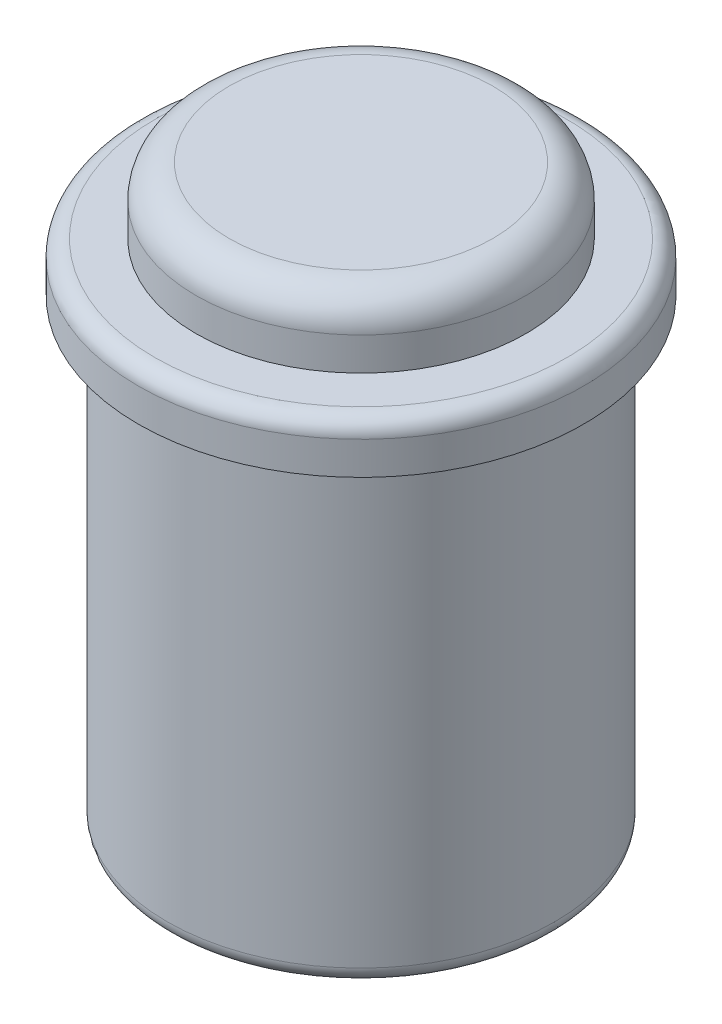
ISO-10303-21;
HEADER;
FILE_DESCRIPTION(('STEP AP214'),'2;1');
FILE_NAME('part.step','',(''),(''),'','','');
FILE_SCHEMA(('AUTOMOTIVE_DESIGN { 1 0 10303 214 1 1 1 1 }'));
ENDSEC;
DATA;
#1=APPLICATION_CONTEXT('core data for automotive mechanical design processes');
#2=APPLICATION_PROTOCOL_DEFINITION('international standard','automotive_design',2000,#1);
#3=PRODUCT_CONTEXT('',#1,'mechanical');
#4=PRODUCT('Part','Part','',(#3));
#5=PRODUCT_RELATED_PRODUCT_CATEGORY('part','',(#4));
#6=PRODUCT_DEFINITION_FORMATION('','',#4);
#7=PRODUCT_DEFINITION_CONTEXT('part definition',#1,'design');
#8=PRODUCT_DEFINITION('design','',#6,#7);
#9=PRODUCT_DEFINITION_SHAPE('','',#8);
#10=(LENGTH_UNIT() NAMED_UNIT(*) SI_UNIT(.MILLI.,.METRE.));
#11=(NAMED_UNIT(*) PLANE_ANGLE_UNIT() SI_UNIT($,.RADIAN.));
#12=(NAMED_UNIT(*) SI_UNIT($,.STERADIAN.) SOLID_ANGLE_UNIT());
#13=UNCERTAINTY_MEASURE_WITH_UNIT(LENGTH_MEASURE(1.E-05),#10,'distance_accuracy_value','');
#14=(GEOMETRIC_REPRESENTATION_CONTEXT(3) GLOBAL_UNCERTAINTY_ASSIGNED_CONTEXT((#13)) GLOBAL_UNIT_ASSIGNED_CONTEXT((#10,
#11,#12)) REPRESENTATION_CONTEXT('',''));
#15=CARTESIAN_POINT('',(0.,0.,0.));
#16=DIRECTION('',(0.,0.,1.));
#17=DIRECTION('',(1.,0.,0.));
#18=AXIS2_PLACEMENT_3D('',#15,#16,#17);
#19=CARTESIAN_POINT('',(0.,-28.,0.));
#20=DIRECTION('',(0.,-1.,0.));
#21=DIRECTION('',(0.,0.,-1.));
#22=AXIS2_PLACEMENT_3D('',#19,#20,#21);
#23=PLANE('',#22);
#24=CARTESIAN_POINT('',(0.,-28.,0.));
#25=DIRECTION('',(0.,-1.,0.));
#26=DIRECTION('',(0.,0.,-1.));
#27=AXIS2_PLACEMENT_3D('',#24,#25,#26);
#28=CIRCLE('',#27,10.75);
#29=CARTESIAN_POINT('',(0.,-28.,-10.75));
#30=VERTEX_POINT('',#29);
#31=EDGE_CURVE('E48',#30,#30,#28,.T.);
#32=ORIENTED_EDGE('',*,*,#31,.T.);
#33=EDGE_LOOP('',(#32));
#34=FACE_BOUND('',#33,.T.);
#35=DIRECTION('',(0.,0.,-1.));
#36=VECTOR('',#35,1.);
#37=CARTESIAN_POINT('',(7.16627862168664,-28.,-2.532751589623));
#38=LINE('',#37,#36);
#39=CARTESIAN_POINT('',(7.16627862168664,-28.,-2.532751589623));
#40=VERTEX_POINT('',#39);
#41=CARTESIAN_POINT('',(7.16627862168664,-28.,-2.88131353127846));
#42=VERTEX_POINT('',#41);
#43=EDGE_CURVE('E110',#40,#42,#38,.T.);
#44=ORIENTED_EDGE('',*,*,#43,.T.);
#45=DIRECTION('',(-1.,0.,0.));
#46=VECTOR('',#45,1.);
#47=CARTESIAN_POINT('',(7.16627862168664,-28.,-2.88131353127846));
#48=LINE('',#47,#46);
#49=CARTESIAN_POINT('',(5.57285260269022,-28.,-2.88131353127846));
#50=VERTEX_POINT('',#49);
#51=EDGE_CURVE('E126',#42,#50,#48,.T.);
#52=ORIENTED_EDGE('',*,*,#51,.T.);
#53=DIRECTION('',(0.,0.,1.));
#54=VECTOR('',#53,1.);
#55=CARTESIAN_POINT('',(5.57285260269022,-28.,-2.532751589623));
#56=LINE('',#55,#54);
#57=CARTESIAN_POINT('',(5.57285260269022,-28.,-2.532751589623));
#58=VERTEX_POINT('',#57);
#59=EDGE_CURVE('E60',#50,#58,#56,.T.);
#60=ORIENTED_EDGE('',*,*,#59,.T.);
#61=DIRECTION('',(1.,0.,0.));
#62=VECTOR('',#61,1.);
#63=CARTESIAN_POINT('',(7.16627862168664,-28.,-2.532751589623));
#64=LINE('',#63,#62);
#65=EDGE_CURVE('E55',#58,#40,#64,.T.);
#66=ORIENTED_EDGE('',*,*,#65,.T.);
#67=EDGE_LOOP('',(#44,#52,#60,#66));
#68=FACE_BOUND('',#67,.T.);
#69=DIRECTION('',(1.,0.,0.));
#70=VECTOR('',#69,1.);
#71=CARTESIAN_POINT('',(-7.16627862168664,-28.,-2.88131353127846));
#72=LINE('',#71,#70);
#73=CARTESIAN_POINT('',(-7.16627862168664,-28.,-2.88131353127846));
#74=VERTEX_POINT('',#73);
#75=CARTESIAN_POINT('',(-5.57285260269022,-28.,-2.88131353127846));
#76=VERTEX_POINT('',#75);
#77=EDGE_CURVE('E172',#74,#76,#72,.T.);
#78=ORIENTED_EDGE('',*,*,#77,.F.);
#79=DIRECTION('',(0.,0.,-1.));
#80=VECTOR('',#79,1.);
#81=CARTESIAN_POINT('',(-7.16627862168664,-28.,-2.532751589623));
#82=LINE('',#81,#80);
#83=CARTESIAN_POINT('',(-7.16627862168664,-28.,-2.532751589623));
#84=VERTEX_POINT('',#83);
#85=EDGE_CURVE('E114',#84,#74,#82,.T.);
#86=ORIENTED_EDGE('',*,*,#85,.F.);
#87=DIRECTION('',(-1.,0.,0.));
#88=VECTOR('',#87,1.);
#89=CARTESIAN_POINT('',(-7.16627862168664,-28.,-2.532751589623));
#90=LINE('',#89,#88);
#91=CARTESIAN_POINT('',(-5.57285260269022,-28.,-2.532751589623));
#92=VERTEX_POINT('',#91);
#93=EDGE_CURVE('E159',#92,#84,#90,.T.);
#94=ORIENTED_EDGE('',*,*,#93,.F.);
#95=DIRECTION('',(0.,0.,1.));
#96=VECTOR('',#95,1.);
#97=CARTESIAN_POINT('',(-5.57285260269022,-28.,-2.532751589623));
#98=LINE('',#97,#96);
#99=EDGE_CURVE('E175',#76,#92,#98,.T.);
#100=ORIENTED_EDGE('',*,*,#99,.F.);
#101=EDGE_LOOP('',(#78,#86,#94,#100));
#102=FACE_BOUND('',#101,.T.);
#103=ADVANCED_FACE('F39',(#34,#68,#102),#23,.T.);
#104=CARTESIAN_POINT('',(0.,3.,0.));
#105=DIRECTION('',(0.,-1.,0.));
#106=DIRECTION('',(0.,0.,-1.));
#107=AXIS2_PLACEMENT_3D('',#104,#105,#106);
#108=CYLINDRICAL_SURFACE('',#107,13.5);
#109=CARTESIAN_POINT('',(0.,2.,0.));
#110=DIRECTION('',(0.,1.,0.));
#111=DIRECTION('',(0.,0.,1.));
#112=AXIS2_PLACEMENT_3D('',#109,#110,#111);
#113=CIRCLE('',#112,13.5);
#114=CARTESIAN_POINT('',(0.,2.,13.5));
#115=VERTEX_POINT('',#114);
#116=EDGE_CURVE('E218',#115,#115,#113,.F.);
#117=ORIENTED_EDGE('',*,*,#116,.T.);
#118=EDGE_LOOP('',(#117));
#119=FACE_BOUND('',#118,.T.);
#120=CARTESIAN_POINT('',(0.,0.,0.));
#121=DIRECTION('',(0.,1.,0.));
#122=DIRECTION('',(0.,0.,1.));
#123=AXIS2_PLACEMENT_3D('',#120,#121,#122);
#124=CIRCLE('',#123,13.5);
#125=CARTESIAN_POINT('',(0.,0.,13.5));
#126=VERTEX_POINT('',#125);
#127=EDGE_CURVE('E194',#126,#126,#124,.T.);
#128=ORIENTED_EDGE('',*,*,#127,.T.);
#129=EDGE_LOOP('',(#128));
#130=FACE_BOUND('',#129,.T.);
#131=ADVANCED_FACE('F236',(#119,#130),#108,.T.);
#132=CARTESIAN_POINT('',(0.,3.,0.));
#133=DIRECTION('',(0.,1.,0.));
#134=DIRECTION('',(0.,0.,1.));
#135=AXIS2_PLACEMENT_3D('',#132,#133,#134);
#136=PLANE('',#135);
#137=CARTESIAN_POINT('',(0.,3.,0.));
#138=DIRECTION('',(0.,1.,0.));
#139=DIRECTION('',(0.,0.,1.));
#140=AXIS2_PLACEMENT_3D('',#137,#138,#139);
#141=CIRCLE('',#140,12.5);
#142=CARTESIAN_POINT('',(0.,3.,12.5));
#143=VERTEX_POINT('',#142);
#144=EDGE_CURVE('E214',#143,#143,#141,.T.);
#145=ORIENTED_EDGE('',*,*,#144,.T.);
#146=EDGE_LOOP('',(#145));
#147=FACE_BOUND('',#146,.T.);
#148=CARTESIAN_POINT('',(0.,3.,0.));
#149=DIRECTION('',(0.,1.,0.));
#150=DIRECTION('',(0.,0.,1.));
#151=AXIS2_PLACEMENT_3D('',#148,#149,#150);
#152=CIRCLE('',#151,10.);
#153=CARTESIAN_POINT('',(0.,3.,10.));
#154=VERTEX_POINT('',#153);
#155=EDGE_CURVE('E200',#154,#154,#152,.T.);
#156=ORIENTED_EDGE('',*,*,#155,.F.);
#157=EDGE_LOOP('',(#156));
#158=FACE_BOUND('',#157,.T.);
#159=ADVANCED_FACE('F241',(#147,#158),#136,.T.);
#160=CARTESIAN_POINT('',(0.,0.,0.));
#161=DIRECTION('',(0.,1.,0.));
#162=DIRECTION('',(0.,0.,1.));
#163=AXIS2_PLACEMENT_3D('',#160,#161,#162);
#164=PLANE('',#163);
#165=CARTESIAN_POINT('',(0.,0.,0.));
#166=DIRECTION('',(0.,-1.,0.));
#167=DIRECTION('',(0.,0.,-1.));
#168=AXIS2_PLACEMENT_3D('',#165,#166,#167);
#169=CIRCLE('',#168,11.75);
#170=CARTESIAN_POINT('',(0.,0.,-11.75));
#171=VERTEX_POINT('',#170);
#172=EDGE_CURVE('E195',#171,#171,#169,.T.);
#173=ORIENTED_EDGE('',*,*,#172,.F.);
#174=EDGE_LOOP('',(#173));
#175=FACE_BOUND('',#174,.T.);
#176=ORIENTED_EDGE('',*,*,#127,.F.);
#177=EDGE_LOOP('',(#176));
#178=FACE_BOUND('',#177,.T.);
#179=ADVANCED_FACE('F259',(#175,#178),#164,.F.);
#180=CARTESIAN_POINT('',(0.,7.,0.));
#181=DIRECTION('',(0.,-1.,0.));
#182=DIRECTION('',(0.,0.,-1.));
#183=AXIS2_PLACEMENT_3D('',#180,#181,#182);
#184=CYLINDRICAL_SURFACE('',#183,10.);
#185=CARTESIAN_POINT('',(0.,5.,0.));
#186=DIRECTION('',(0.,1.,0.));
#187=DIRECTION('',(0.,0.,1.));
#188=AXIS2_PLACEMENT_3D('',#185,#186,#187);
#189=CIRCLE('',#188,10.);
#190=CARTESIAN_POINT('',(0.,5.,10.));
#191=VERTEX_POINT('',#190);
#192=EDGE_CURVE('E210',#191,#191,#189,.F.);
#193=ORIENTED_EDGE('',*,*,#192,.T.);
#194=EDGE_LOOP('',(#193));
#195=FACE_BOUND('',#194,.T.);
#196=ORIENTED_EDGE('',*,*,#155,.T.);
#197=EDGE_LOOP('',(#196));
#198=FACE_BOUND('',#197,.T.);
#199=ADVANCED_FACE('F255',(#195,#198),#184,.T.);
#200=CARTESIAN_POINT('',(0.,7.,0.));
#201=DIRECTION('',(0.,1.,0.));
#202=DIRECTION('',(0.,0.,1.));
#203=AXIS2_PLACEMENT_3D('',#200,#201,#202);
#204=PLANE('',#203);
#205=CARTESIAN_POINT('',(0.,7.,0.));
#206=DIRECTION('',(0.,1.,0.));
#207=DIRECTION('',(0.,0.,1.));
#208=AXIS2_PLACEMENT_3D('',#205,#206,#207);
#209=CIRCLE('',#208,8.);
#210=CARTESIAN_POINT('',(0.,7.,8.));
#211=VERTEX_POINT('',#210);
#212=EDGE_CURVE('E199',#211,#211,#209,.T.);
#213=ORIENTED_EDGE('',*,*,#212,.T.);
#214=EDGE_LOOP('',(#213));
#215=FACE_BOUND('',#214,.T.);
#216=ADVANCED_FACE('F251',(#215),#204,.T.);
#217=CARTESIAN_POINT('',(0.,-28.,0.));
#218=DIRECTION('',(0.,1.,0.));
#219=DIRECTION('',(0.,0.,1.));
#220=AXIS2_PLACEMENT_3D('',#217,#218,#219);
#221=CYLINDRICAL_SURFACE('',#220,11.75);
#222=CARTESIAN_POINT('',(0.,-27.,0.));
#223=DIRECTION('',(0.,-1.,0.));
#224=DIRECTION('',(0.,0.,-1.));
#225=AXIS2_PLACEMENT_3D('',#222,#223,#224);
#226=CIRCLE('',#225,11.75);
#227=CARTESIAN_POINT('',(0.,-27.,-11.75));
#228=VERTEX_POINT('',#227);
#229=EDGE_CURVE('E11',#228,#228,#226,.F.);
#230=ORIENTED_EDGE('',*,*,#229,.T.);
#231=EDGE_LOOP('',(#230));
#232=FACE_BOUND('',#231,.T.);
#233=ORIENTED_EDGE('',*,*,#172,.T.);
#234=EDGE_LOOP('',(#233));
#235=FACE_BOUND('',#234,.T.);
#236=ADVANCED_FACE('F248',(#232,#235),#221,.T.);
#237=CARTESIAN_POINT('',(-7.16627862168664,-30.8,-2.532751589623));
#238=DIRECTION('',(1.,0.,0.));
#239=DIRECTION('',(0.,0.,-1.));
#240=AXIS2_PLACEMENT_3D('',#237,#238,#239);
#241=PLANE('',#240);
#242=ORIENTED_EDGE('',*,*,#85,.T.);
#243=DIRECTION('',(0.,1.,0.));
#244=VECTOR('',#243,1.);
#245=CARTESIAN_POINT('',(-7.16627862168664,-30.8,-2.88131353127846));
#246=LINE('',#245,#244);
#247=CARTESIAN_POINT('',(-7.16627862168664,-30.8,-2.88131353127846));
#248=VERTEX_POINT('',#247);
#249=EDGE_CURVE('E191',#248,#74,#246,.T.);
#250=ORIENTED_EDGE('',*,*,#249,.F.);
#251=DIRECTION('',(0.,0.,-1.));
#252=VECTOR('',#251,1.);
#253=CARTESIAN_POINT('',(-7.16627862168664,-30.8,-2.532751589623));
#254=LINE('',#253,#252);
#255=CARTESIAN_POINT('',(-7.16627862168664,-30.8,-2.532751589623));
#256=VERTEX_POINT('',#255);
#257=EDGE_CURVE('E154',#256,#248,#254,.T.);
#258=ORIENTED_EDGE('',*,*,#257,.F.);
#259=DIRECTION('',(0.,1.,0.));
#260=VECTOR('',#259,1.);
#261=CARTESIAN_POINT('',(-7.16627862168664,-30.8,-2.532751589623));
#262=LINE('',#261,#260);
#263=EDGE_CURVE('E168',#256,#84,#262,.T.);
#264=ORIENTED_EDGE('',*,*,#263,.T.);
#265=EDGE_LOOP('',(#242,#250,#258,#264));
#266=FACE_BOUND('',#265,.T.);
#267=ADVANCED_FACE('F246',(#266),#241,.F.);
#268=CARTESIAN_POINT('',(-7.16627862168664,-30.8,-2.88131353127846));
#269=DIRECTION('',(0.,0.,1.));
#270=DIRECTION('',(1.,0.,0.));
#271=AXIS2_PLACEMENT_3D('',#268,#269,#270);
#272=PLANE('',#271);
#273=ORIENTED_EDGE('',*,*,#77,.T.);
#274=DIRECTION('',(0.,1.,0.));
#275=VECTOR('',#274,1.);
#276=CARTESIAN_POINT('',(-5.57285260269022,-30.8,-2.88131353127846));
#277=LINE('',#276,#275);
#278=CARTESIAN_POINT('',(-5.57285260269022,-30.8,-2.88131353127846));
#279=VERTEX_POINT('',#278);
#280=EDGE_CURVE('E187',#279,#76,#277,.T.);
#281=ORIENTED_EDGE('',*,*,#280,.F.);
#282=DIRECTION('',(1.,0.,0.));
#283=VECTOR('',#282,1.);
#284=CARTESIAN_POINT('',(-7.16627862168664,-30.8,-2.88131353127846));
#285=LINE('',#284,#283);
#286=EDGE_CURVE('E158',#248,#279,#285,.T.);
#287=ORIENTED_EDGE('',*,*,#286,.F.);
#288=ORIENTED_EDGE('',*,*,#249,.T.);
#289=EDGE_LOOP('',(#273,#281,#287,#288));
#290=FACE_BOUND('',#289,.T.);
#291=ADVANCED_FACE('F304',(#290),#272,.F.);
#292=CARTESIAN_POINT('',(-5.57285260269022,-30.8,-2.532751589623));
#293=DIRECTION('',(-1.,0.,0.));
#294=DIRECTION('',(0.,0.,1.));
#295=AXIS2_PLACEMENT_3D('',#292,#293,#294);
#296=PLANE('',#295);
#297=ORIENTED_EDGE('',*,*,#99,.T.);
#298=DIRECTION('',(0.,1.,0.));
#299=VECTOR('',#298,1.);
#300=CARTESIAN_POINT('',(-5.57285260269022,-30.8,-2.532751589623));
#301=LINE('',#300,#299);
#302=CARTESIAN_POINT('',(-5.57285260269022,-30.8,-2.532751589623));
#303=VERTEX_POINT('',#302);
#304=EDGE_CURVE('E184',#303,#92,#301,.T.);
#305=ORIENTED_EDGE('',*,*,#304,.F.);
#306=DIRECTION('',(0.,0.,1.));
#307=VECTOR('',#306,1.);
#308=CARTESIAN_POINT('',(-5.57285260269022,-30.8,-2.532751589623));
#309=LINE('',#308,#307);
#310=EDGE_CURVE('E162',#279,#303,#309,.T.);
#311=ORIENTED_EDGE('',*,*,#310,.F.);
#312=ORIENTED_EDGE('',*,*,#280,.T.);
#313=EDGE_LOOP('',(#297,#305,#311,#312));
#314=FACE_BOUND('',#313,.T.);
#315=ADVANCED_FACE('F301',(#314),#296,.F.);
#316=CARTESIAN_POINT('',(-7.16627862168664,-30.8,-2.532751589623));
#317=DIRECTION('',(0.,0.,-1.));
#318=DIRECTION('',(-1.,0.,0.));
#319=AXIS2_PLACEMENT_3D('',#316,#317,#318);
#320=PLANE('',#319);
#321=ORIENTED_EDGE('',*,*,#93,.T.);
#322=ORIENTED_EDGE('',*,*,#263,.F.);
#323=DIRECTION('',(-1.,0.,0.));
#324=VECTOR('',#323,1.);
#325=CARTESIAN_POINT('',(-7.16627862168664,-30.8,-2.532751589623));
#326=LINE('',#325,#324);
#327=EDGE_CURVE('E165',#303,#256,#326,.T.);
#328=ORIENTED_EDGE('',*,*,#327,.F.);
#329=ORIENTED_EDGE('',*,*,#304,.T.);
#330=EDGE_LOOP('',(#321,#322,#328,#329));
#331=FACE_BOUND('',#330,.T.);
#332=ADVANCED_FACE('F297',(#331),#320,.F.);
#333=CARTESIAN_POINT('',(0.,-30.8,0.));
#334=DIRECTION('',(0.,-1.,0.));
#335=DIRECTION('',(0.,0.,-1.));
#336=AXIS2_PLACEMENT_3D('',#333,#334,#335);
#337=PLANE('',#336);
#338=ORIENTED_EDGE('',*,*,#257,.T.);
#339=ORIENTED_EDGE('',*,*,#286,.T.);
#340=ORIENTED_EDGE('',*,*,#310,.T.);
#341=ORIENTED_EDGE('',*,*,#327,.T.);
#342=EDGE_LOOP('',(#338,#339,#340,#341));
#343=FACE_BOUND('',#342,.T.);
#344=ADVANCED_FACE('F294',(#343),#337,.T.);
#345=CARTESIAN_POINT('',(7.16627862168664,-30.8,-2.532751589623));
#346=DIRECTION('',(1.,0.,0.));
#347=DIRECTION('',(0.,0.,-1.));
#348=AXIS2_PLACEMENT_3D('',#345,#346,#347);
#349=PLANE('',#348);
#350=ORIENTED_EDGE('',*,*,#43,.F.);
#351=DIRECTION('',(0.,1.,0.));
#352=VECTOR('',#351,1.);
#353=CARTESIAN_POINT('',(7.16627862168664,-30.8,-2.532751589623));
#354=LINE('',#353,#352);
#355=CARTESIAN_POINT('',(7.16627862168664,-30.8,-2.532751589623));
#356=VERTEX_POINT('',#355);
#357=EDGE_CURVE('E104',#356,#40,#354,.T.);
#358=ORIENTED_EDGE('',*,*,#357,.F.);
#359=DIRECTION('',(0.,0.,-1.));
#360=VECTOR('',#359,1.);
#361=CARTESIAN_POINT('',(7.16627862168664,-30.8,-2.532751589623));
#362=LINE('',#361,#360);
#363=CARTESIAN_POINT('',(7.16627862168664,-30.8,-2.88131353127846));
#364=VERTEX_POINT('',#363);
#365=EDGE_CURVE('E108',#356,#364,#362,.T.);
#366=ORIENTED_EDGE('',*,*,#365,.T.);
#367=DIRECTION('',(0.,1.,0.));
#368=VECTOR('',#367,1.);
#369=CARTESIAN_POINT('',(7.16627862168664,-30.8,-2.88131353127846));
#370=LINE('',#369,#368);
#371=EDGE_CURVE('E137',#364,#42,#370,.T.);
#372=ORIENTED_EDGE('',*,*,#371,.T.);
#373=EDGE_LOOP('',(#350,#358,#366,#372));
#374=FACE_BOUND('',#373,.T.);
#375=ADVANCED_FACE('F106',(#374),#349,.T.);
#376=CARTESIAN_POINT('',(7.16627862168664,-30.8,-2.532751589623));
#377=DIRECTION('',(0.,0.,1.));
#378=DIRECTION('',(1.,0.,0.));
#379=AXIS2_PLACEMENT_3D('',#376,#377,#378);
#380=PLANE('',#379);
#381=ORIENTED_EDGE('',*,*,#65,.F.);
#382=DIRECTION('',(0.,1.,0.));
#383=VECTOR('',#382,1.);
#384=CARTESIAN_POINT('',(5.57285260269022,-30.8,-2.532751589623));
#385=LINE('',#384,#383);
#386=CARTESIAN_POINT('',(5.57285260269022,-30.8,-2.532751589623));
#387=VERTEX_POINT('',#386);
#388=EDGE_CURVE('E115',#387,#58,#385,.T.);
#389=ORIENTED_EDGE('',*,*,#388,.F.);
#390=DIRECTION('',(1.,0.,0.));
#391=VECTOR('',#390,1.);
#392=CARTESIAN_POINT('',(7.16627862168664,-30.8,-2.532751589623));
#393=LINE('',#392,#391);
#394=EDGE_CURVE('E121',#387,#356,#393,.T.);
#395=ORIENTED_EDGE('',*,*,#394,.T.);
#396=ORIENTED_EDGE('',*,*,#357,.T.);
#397=EDGE_LOOP('',(#381,#389,#395,#396));
#398=FACE_BOUND('',#397,.T.);
#399=ADVANCED_FACE('F128',(#398),#380,.T.);
#400=CARTESIAN_POINT('',(5.57285260269022,-30.8,-2.532751589623));
#401=DIRECTION('',(-1.,0.,0.));
#402=DIRECTION('',(0.,0.,1.));
#403=AXIS2_PLACEMENT_3D('',#400,#401,#402);
#404=PLANE('',#403);
#405=ORIENTED_EDGE('',*,*,#59,.F.);
#406=DIRECTION('',(0.,1.,0.));
#407=VECTOR('',#406,1.);
#408=CARTESIAN_POINT('',(5.57285260269022,-30.8,-2.88131353127846));
#409=LINE('',#408,#407);
#410=CARTESIAN_POINT('',(5.57285260269022,-30.8,-2.88131353127846));
#411=VERTEX_POINT('',#410);
#412=EDGE_CURVE('E148',#411,#50,#409,.T.);
#413=ORIENTED_EDGE('',*,*,#412,.F.);
#414=DIRECTION('',(0.,0.,1.));
#415=VECTOR('',#414,1.);
#416=CARTESIAN_POINT('',(5.57285260269022,-30.8,-2.532751589623));
#417=LINE('',#416,#415);
#418=EDGE_CURVE('E130',#411,#387,#417,.T.);
#419=ORIENTED_EDGE('',*,*,#418,.T.);
#420=ORIENTED_EDGE('',*,*,#388,.T.);
#421=EDGE_LOOP('',(#405,#413,#419,#420));
#422=FACE_BOUND('',#421,.T.);
#423=ADVANCED_FACE('F283',(#422),#404,.T.);
#424=CARTESIAN_POINT('',(7.16627862168664,-30.8,-2.88131353127846));
#425=DIRECTION('',(0.,0.,-1.));
#426=DIRECTION('',(-1.,0.,0.));
#427=AXIS2_PLACEMENT_3D('',#424,#425,#426);
#428=PLANE('',#427);
#429=ORIENTED_EDGE('',*,*,#51,.F.);
#430=ORIENTED_EDGE('',*,*,#371,.F.);
#431=DIRECTION('',(-1.,0.,0.));
#432=VECTOR('',#431,1.);
#433=CARTESIAN_POINT('',(7.16627862168664,-30.8,-2.88131353127846));
#434=LINE('',#433,#432);
#435=EDGE_CURVE('E124',#364,#411,#434,.T.);
#436=ORIENTED_EDGE('',*,*,#435,.T.);
#437=ORIENTED_EDGE('',*,*,#412,.T.);
#438=EDGE_LOOP('',(#429,#430,#436,#437));
#439=FACE_BOUND('',#438,.T.);
#440=ADVANCED_FACE('F272',(#439),#428,.T.);
#441=CARTESIAN_POINT('',(0.,-30.8,0.));
#442=DIRECTION('',(0.,-1.,0.));
#443=DIRECTION('',(0.,0.,-1.));
#444=AXIS2_PLACEMENT_3D('',#441,#442,#443);
#445=PLANE('',#444);
#446=ORIENTED_EDGE('',*,*,#365,.F.);
#447=ORIENTED_EDGE('',*,*,#394,.F.);
#448=ORIENTED_EDGE('',*,*,#418,.F.);
#449=ORIENTED_EDGE('',*,*,#435,.F.);
#450=EDGE_LOOP('',(#446,#447,#448,#449));
#451=FACE_BOUND('',#450,.T.);
#452=ADVANCED_FACE('F119',(#451),#445,.T.);
#453=CARTESIAN_POINT('',(0.,5.,0.));
#454=DIRECTION('',(0.,1.,0.));
#455=DIRECTION('',(0.,0.,1.));
#456=AXIS2_PLACEMENT_3D('',#453,#454,#455);
#457=TOROIDAL_SURFACE('',#456,8.,2.);
#458=ORIENTED_EDGE('',*,*,#192,.F.);
#459=EDGE_LOOP('',(#458));
#460=FACE_BOUND('',#459,.T.);
#461=ORIENTED_EDGE('',*,*,#212,.F.);
#462=EDGE_LOOP('',(#461));
#463=FACE_BOUND('',#462,.T.);
#464=ADVANCED_FACE('F232',(#460,#463),#457,.T.);
#465=CARTESIAN_POINT('',(0.,2.,0.));
#466=DIRECTION('',(0.,1.,0.));
#467=DIRECTION('',(0.,0.,1.));
#468=AXIS2_PLACEMENT_3D('',#465,#466,#467);
#469=TOROIDAL_SURFACE('',#468,12.5,1.);
#470=ORIENTED_EDGE('',*,*,#116,.F.);
#471=EDGE_LOOP('',(#470));
#472=FACE_BOUND('',#471,.T.);
#473=ORIENTED_EDGE('',*,*,#144,.F.);
#474=EDGE_LOOP('',(#473));
#475=FACE_BOUND('',#474,.T.);
#476=ADVANCED_FACE('F227',(#472,#475),#469,.T.);
#477=CARTESIAN_POINT('',(0.,-27.,0.));
#478=DIRECTION('',(0.,-1.,0.));
#479=DIRECTION('',(0.,0.,-1.));
#480=AXIS2_PLACEMENT_3D('',#477,#478,#479);
#481=TOROIDAL_SURFACE('',#480,10.75,1.);
#482=ORIENTED_EDGE('',*,*,#229,.F.);
#483=EDGE_LOOP('',(#482));
#484=FACE_BOUND('',#483,.T.);
#485=ORIENTED_EDGE('',*,*,#31,.F.);
#486=EDGE_LOOP('',(#485));
#487=FACE_BOUND('',#486,.T.);
#488=ADVANCED_FACE('F41',(#484,#487),#481,.T.);
#489=CLOSED_SHELL('',(#103,#131,#159,#179,#199,#216,#236,#267,#291,#315,#332,#344,#375,#399,
#423,#440,#452,#464,#476,#488));
#490=MANIFOLD_SOLID_BREP('B2',#489);
#491=ADVANCED_BREP_SHAPE_REPRESENTATION('',(#18,#490),#14);
#492=SHAPE_DEFINITION_REPRESENTATION(#9,#491);
ENDSEC;
END-ISO-10303-21;
